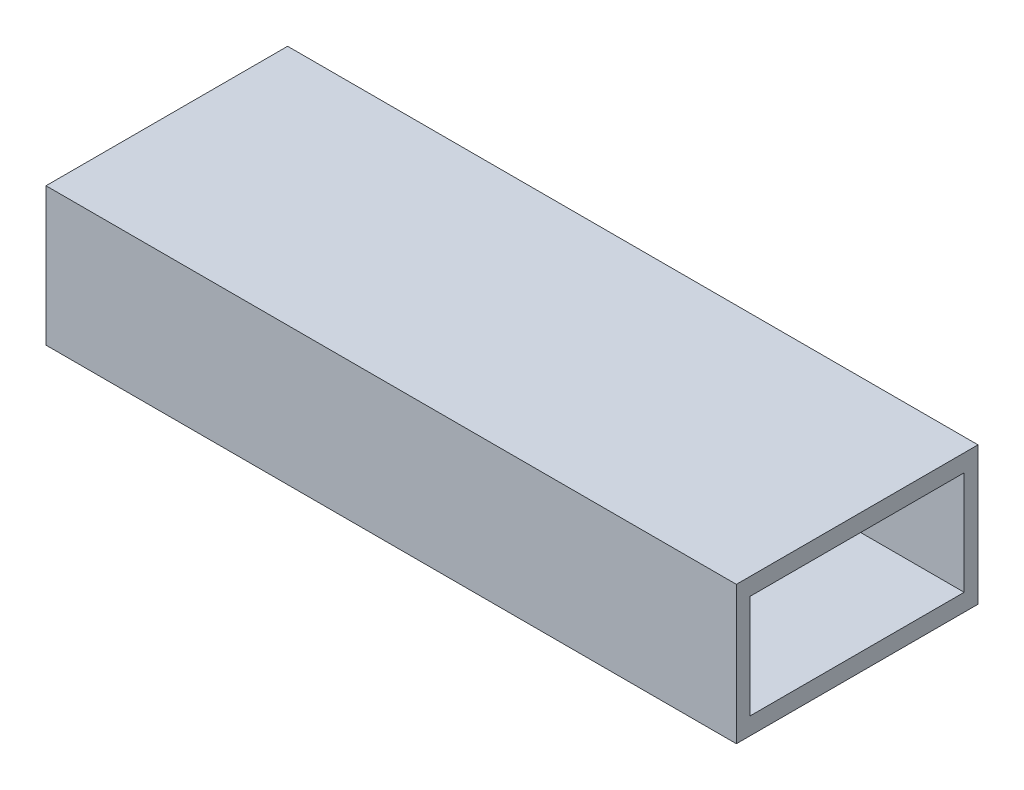
ISO-10303-21;
HEADER;
FILE_DESCRIPTION(('STEP AP214'),'2;1');
FILE_NAME('part.step','',(''),(''),'','','');
FILE_SCHEMA(('AUTOMOTIVE_DESIGN { 1 0 10303 214 1 1 1 1 }'));
ENDSEC;
DATA;
#1=APPLICATION_CONTEXT('core data for automotive mechanical design processes');
#2=APPLICATION_PROTOCOL_DEFINITION('international standard','automotive_design',2000,#1);
#3=PRODUCT_CONTEXT('',#1,'mechanical');
#4=PRODUCT('Part','Part','',(#3));
#5=PRODUCT_RELATED_PRODUCT_CATEGORY('part','',(#4));
#6=PRODUCT_DEFINITION_FORMATION('','',#4);
#7=PRODUCT_DEFINITION_CONTEXT('part definition',#1,'design');
#8=PRODUCT_DEFINITION('design','',#6,#7);
#9=PRODUCT_DEFINITION_SHAPE('','',#8);
#10=(LENGTH_UNIT() NAMED_UNIT(*) SI_UNIT(.MILLI.,.METRE.));
#11=(NAMED_UNIT(*) PLANE_ANGLE_UNIT() SI_UNIT($,.RADIAN.));
#12=(NAMED_UNIT(*) SI_UNIT($,.STERADIAN.) SOLID_ANGLE_UNIT());
#13=UNCERTAINTY_MEASURE_WITH_UNIT(LENGTH_MEASURE(1.E-05),#10,'distance_accuracy_value','');
#14=(GEOMETRIC_REPRESENTATION_CONTEXT(3) GLOBAL_UNCERTAINTY_ASSIGNED_CONTEXT((#13)) GLOBAL_UNIT_ASSIGNED_CONTEXT((#10,
#11,#12)) REPRESENTATION_CONTEXT('',''));
#15=CARTESIAN_POINT('',(0.,0.,0.));
#16=DIRECTION('',(0.,0.,1.));
#17=DIRECTION('',(1.,0.,0.));
#18=AXIS2_PLACEMENT_3D('',#15,#16,#17);
#19=CARTESIAN_POINT('',(100.,0.,0.));
#20=DIRECTION('',(1.,0.,0.));
#21=DIRECTION('',(0.,0.,-1.));
#22=AXIS2_PLACEMENT_3D('',#19,#20,#21);
#23=PLANE('',#22);
#24=DIRECTION('',(0.,1.,0.));
#25=VECTOR('',#24,1.);
#26=CARTESIAN_POINT('',(100.,10.,-17.5));
#27=LINE('',#26,#25);
#28=CARTESIAN_POINT('',(100.,-10.,-17.5));
#29=VERTEX_POINT('',#28);
#30=CARTESIAN_POINT('',(100.,10.,-17.5));
#31=VERTEX_POINT('',#30);
#32=EDGE_CURVE('E159',#29,#31,#27,.T.);
#33=ORIENTED_EDGE('',*,*,#32,.T.);
#34=DIRECTION('',(0.,0.,1.));
#35=VECTOR('',#34,1.);
#36=CARTESIAN_POINT('',(100.,10.,17.5));
#37=LINE('',#36,#35);
#38=CARTESIAN_POINT('',(100.,10.,17.5));
#39=VERTEX_POINT('',#38);
#40=EDGE_CURVE('E163',#31,#39,#37,.T.);
#41=ORIENTED_EDGE('',*,*,#40,.T.);
#42=DIRECTION('',(0.,-1.,0.));
#43=VECTOR('',#42,1.);
#44=CARTESIAN_POINT('',(100.,10.,17.5));
#45=LINE('',#44,#43);
#46=CARTESIAN_POINT('',(100.,-10.,17.5));
#47=VERTEX_POINT('',#46);
#48=EDGE_CURVE('E167',#39,#47,#45,.T.);
#49=ORIENTED_EDGE('',*,*,#48,.T.);
#50=DIRECTION('',(0.,0.,-1.));
#51=VECTOR('',#50,1.);
#52=CARTESIAN_POINT('',(100.,-10.,17.5));
#53=LINE('',#52,#51);
#54=EDGE_CURVE('E170',#47,#29,#53,.T.);
#55=ORIENTED_EDGE('',*,*,#54,.T.);
#56=EDGE_LOOP('',(#33,#41,#49,#55));
#57=FACE_BOUND('',#56,.T.);
#58=DIRECTION('',(0.,0.,1.));
#59=VECTOR('',#58,1.);
#60=CARTESIAN_POINT('',(100.,7.5,15.5));
#61=LINE('',#60,#59);
#62=CARTESIAN_POINT('',(100.,7.5,-15.5));
#63=VERTEX_POINT('',#62);
#64=CARTESIAN_POINT('',(100.,7.5,15.5));
#65=VERTEX_POINT('',#64);
#66=EDGE_CURVE('E120',#63,#65,#61,.T.);
#67=ORIENTED_EDGE('',*,*,#66,.F.);
#68=DIRECTION('',(0.,1.,0.));
#69=VECTOR('',#68,1.);
#70=CARTESIAN_POINT('',(100.,7.5,-15.5));
#71=LINE('',#70,#69);
#72=CARTESIAN_POINT('',(100.,-7.5,-15.5));
#73=VERTEX_POINT('',#72);
#74=EDGE_CURVE('E111',#73,#63,#71,.T.);
#75=ORIENTED_EDGE('',*,*,#74,.F.);
#76=DIRECTION('',(0.,0.,-1.));
#77=VECTOR('',#76,1.);
#78=CARTESIAN_POINT('',(100.,-7.5,15.5));
#79=LINE('',#78,#77);
#80=CARTESIAN_POINT('',(100.,-7.5,15.5));
#81=VERTEX_POINT('',#80);
#82=EDGE_CURVE('E137',#81,#73,#79,.T.);
#83=ORIENTED_EDGE('',*,*,#82,.F.);
#84=DIRECTION('',(0.,-1.,0.));
#85=VECTOR('',#84,1.);
#86=CARTESIAN_POINT('',(100.,7.5,15.5));
#87=LINE('',#86,#85);
#88=EDGE_CURVE('E133',#65,#81,#87,.T.);
#89=ORIENTED_EDGE('',*,*,#88,.F.);
#90=EDGE_LOOP('',(#67,#75,#83,#89));
#91=FACE_BOUND('',#90,.T.);
#92=ADVANCED_FACE('F45',(#57,#91),#23,.T.);
#93=CARTESIAN_POINT('',(0.,0.,0.));
#94=DIRECTION('',(1.,0.,0.));
#95=DIRECTION('',(0.,0.,-1.));
#96=AXIS2_PLACEMENT_3D('',#93,#94,#95);
#97=PLANE('',#96);
#98=DIRECTION('',(0.,1.,0.));
#99=VECTOR('',#98,1.);
#100=CARTESIAN_POINT('',(0.,10.,-17.5));
#101=LINE('',#100,#99);
#102=CARTESIAN_POINT('',(0.,-10.,-17.5));
#103=VERTEX_POINT('',#102);
#104=CARTESIAN_POINT('',(0.,10.,-17.5));
#105=VERTEX_POINT('',#104);
#106=EDGE_CURVE('E129',#103,#105,#101,.T.);
#107=ORIENTED_EDGE('',*,*,#106,.F.);
#108=DIRECTION('',(0.,0.,-1.));
#109=VECTOR('',#108,1.);
#110=CARTESIAN_POINT('',(0.,-10.,17.5));
#111=LINE('',#110,#109);
#112=CARTESIAN_POINT('',(0.,-10.,17.5));
#113=VERTEX_POINT('',#112);
#114=EDGE_CURVE('E164',#113,#103,#111,.T.);
#115=ORIENTED_EDGE('',*,*,#114,.F.);
#116=DIRECTION('',(0.,-1.,0.));
#117=VECTOR('',#116,1.);
#118=CARTESIAN_POINT('',(0.,10.,17.5));
#119=LINE('',#118,#117);
#120=CARTESIAN_POINT('',(0.,10.,17.5));
#121=VERTEX_POINT('',#120);
#122=EDGE_CURVE('E180',#121,#113,#119,.T.);
#123=ORIENTED_EDGE('',*,*,#122,.F.);
#124=DIRECTION('',(0.,0.,1.));
#125=VECTOR('',#124,1.);
#126=CARTESIAN_POINT('',(0.,10.,17.5));
#127=LINE('',#126,#125);
#128=EDGE_CURVE('E177',#105,#121,#127,.T.);
#129=ORIENTED_EDGE('',*,*,#128,.F.);
#130=EDGE_LOOP('',(#107,#115,#123,#129));
#131=FACE_BOUND('',#130,.T.);
#132=DIRECTION('',(0.,1.,0.));
#133=VECTOR('',#132,1.);
#134=CARTESIAN_POINT('',(0.,7.5,-15.5));
#135=LINE('',#134,#133);
#136=CARTESIAN_POINT('',(0.,-7.5,-15.5));
#137=VERTEX_POINT('',#136);
#138=CARTESIAN_POINT('',(0.,7.5,-15.5));
#139=VERTEX_POINT('',#138);
#140=EDGE_CURVE('E69',#137,#139,#135,.T.);
#141=ORIENTED_EDGE('',*,*,#140,.T.);
#142=DIRECTION('',(0.,0.,1.));
#143=VECTOR('',#142,1.);
#144=CARTESIAN_POINT('',(0.,7.5,15.5));
#145=LINE('',#144,#143);
#146=CARTESIAN_POINT('',(0.,7.5,15.5));
#147=VERTEX_POINT('',#146);
#148=EDGE_CURVE('E127',#139,#147,#145,.T.);
#149=ORIENTED_EDGE('',*,*,#148,.T.);
#150=DIRECTION('',(0.,-1.,0.));
#151=VECTOR('',#150,1.);
#152=CARTESIAN_POINT('',(0.,7.5,15.5));
#153=LINE('',#152,#151);
#154=CARTESIAN_POINT('',(0.,-7.5,15.5));
#155=VERTEX_POINT('',#154);
#156=EDGE_CURVE('E146',#147,#155,#153,.T.);
#157=ORIENTED_EDGE('',*,*,#156,.T.);
#158=DIRECTION('',(0.,0.,-1.));
#159=VECTOR('',#158,1.);
#160=CARTESIAN_POINT('',(0.,-7.5,15.5));
#161=LINE('',#160,#159);
#162=EDGE_CURVE('E121',#155,#137,#161,.T.);
#163=ORIENTED_EDGE('',*,*,#162,.T.);
#164=EDGE_LOOP('',(#141,#149,#157,#163));
#165=FACE_BOUND('',#164,.T.);
#166=ADVANCED_FACE('F203',(#131,#165),#97,.F.);
#167=CARTESIAN_POINT('',(100.,10.,-17.5));
#168=DIRECTION('',(0.,0.,1.));
#169=DIRECTION('',(0.,-1.,0.));
#170=AXIS2_PLACEMENT_3D('',#167,#168,#169);
#171=PLANE('',#170);
#172=ORIENTED_EDGE('',*,*,#106,.T.);
#173=DIRECTION('',(-1.,0.,0.));
#174=VECTOR('',#173,1.);
#175=CARTESIAN_POINT('',(100.,10.,-17.5));
#176=LINE('',#175,#174);
#177=EDGE_CURVE('E11',#31,#105,#176,.T.);
#178=ORIENTED_EDGE('',*,*,#177,.F.);
#179=ORIENTED_EDGE('',*,*,#32,.F.);
#180=DIRECTION('',(-1.,0.,0.));
#181=VECTOR('',#180,1.);
#182=CARTESIAN_POINT('',(100.,-10.,-17.5));
#183=LINE('',#182,#181);
#184=EDGE_CURVE('E173',#29,#103,#183,.T.);
#185=ORIENTED_EDGE('',*,*,#184,.T.);
#186=EDGE_LOOP('',(#172,#178,#179,#185));
#187=FACE_BOUND('',#186,.T.);
#188=ADVANCED_FACE('F47',(#187),#171,.F.);
#189=CARTESIAN_POINT('',(100.,10.,17.5));
#190=DIRECTION('',(0.,-1.,0.));
#191=DIRECTION('',(0.,0.,-1.));
#192=AXIS2_PLACEMENT_3D('',#189,#190,#191);
#193=PLANE('',#192);
#194=ORIENTED_EDGE('',*,*,#128,.T.);
#195=DIRECTION('',(-1.,0.,0.));
#196=VECTOR('',#195,1.);
#197=CARTESIAN_POINT('',(100.,10.,17.5));
#198=LINE('',#197,#196);
#199=EDGE_CURVE('E54',#39,#121,#198,.T.);
#200=ORIENTED_EDGE('',*,*,#199,.F.);
#201=ORIENTED_EDGE('',*,*,#40,.F.);
#202=ORIENTED_EDGE('',*,*,#177,.T.);
#203=EDGE_LOOP('',(#194,#200,#201,#202));
#204=FACE_BOUND('',#203,.T.);
#205=ADVANCED_FACE('F213',(#204),#193,.F.);
#206=CARTESIAN_POINT('',(100.,10.,17.5));
#207=DIRECTION('',(0.,0.,-1.));
#208=DIRECTION('',(0.,1.,0.));
#209=AXIS2_PLACEMENT_3D('',#206,#207,#208);
#210=PLANE('',#209);
#211=ORIENTED_EDGE('',*,*,#122,.T.);
#212=DIRECTION('',(-1.,0.,0.));
#213=VECTOR('',#212,1.);
#214=CARTESIAN_POINT('',(100.,-10.,17.5));
#215=LINE('',#214,#213);
#216=EDGE_CURVE('E188',#47,#113,#215,.T.);
#217=ORIENTED_EDGE('',*,*,#216,.F.);
#218=ORIENTED_EDGE('',*,*,#48,.F.);
#219=ORIENTED_EDGE('',*,*,#199,.T.);
#220=EDGE_LOOP('',(#211,#217,#218,#219));
#221=FACE_BOUND('',#220,.T.);
#222=ADVANCED_FACE('F197',(#221),#210,.F.);
#223=CARTESIAN_POINT('',(100.,-10.,17.5));
#224=DIRECTION('',(0.,1.,0.));
#225=DIRECTION('',(0.,0.,1.));
#226=AXIS2_PLACEMENT_3D('',#223,#224,#225);
#227=PLANE('',#226);
#228=ORIENTED_EDGE('',*,*,#114,.T.);
#229=ORIENTED_EDGE('',*,*,#184,.F.);
#230=ORIENTED_EDGE('',*,*,#54,.F.);
#231=ORIENTED_EDGE('',*,*,#216,.T.);
#232=EDGE_LOOP('',(#228,#229,#230,#231));
#233=FACE_BOUND('',#232,.T.);
#234=ADVANCED_FACE('F207',(#233),#227,.F.);
#235=CARTESIAN_POINT('',(100.,7.5,-15.5));
#236=DIRECTION('',(0.,0.,1.));
#237=DIRECTION('',(1.,0.,0.));
#238=AXIS2_PLACEMENT_3D('',#235,#236,#237);
#239=PLANE('',#238);
#240=ORIENTED_EDGE('',*,*,#140,.F.);
#241=DIRECTION('',(-1.,0.,0.));
#242=VECTOR('',#241,1.);
#243=CARTESIAN_POINT('',(100.,-7.5,-15.5));
#244=LINE('',#243,#242);
#245=EDGE_CURVE('E115',#73,#137,#244,.T.);
#246=ORIENTED_EDGE('',*,*,#245,.F.);
#247=ORIENTED_EDGE('',*,*,#74,.T.);
#248=DIRECTION('',(-1.,0.,0.));
#249=VECTOR('',#248,1.);
#250=CARTESIAN_POINT('',(100.,7.5,-15.5));
#251=LINE('',#250,#249);
#252=EDGE_CURVE('E114',#63,#139,#251,.T.);
#253=ORIENTED_EDGE('',*,*,#252,.T.);
#254=EDGE_LOOP('',(#240,#246,#247,#253));
#255=FACE_BOUND('',#254,.T.);
#256=ADVANCED_FACE('F113',(#255),#239,.T.);
#257=CARTESIAN_POINT('',(100.,7.5,15.5));
#258=DIRECTION('',(0.,-1.,0.));
#259=DIRECTION('',(0.,0.,-1.));
#260=AXIS2_PLACEMENT_3D('',#257,#258,#259);
#261=PLANE('',#260);
#262=ORIENTED_EDGE('',*,*,#148,.F.);
#263=ORIENTED_EDGE('',*,*,#252,.F.);
#264=ORIENTED_EDGE('',*,*,#66,.T.);
#265=DIRECTION('',(-1.,0.,0.));
#266=VECTOR('',#265,1.);
#267=CARTESIAN_POINT('',(100.,7.5,15.5));
#268=LINE('',#267,#266);
#269=EDGE_CURVE('E130',#65,#147,#268,.T.);
#270=ORIENTED_EDGE('',*,*,#269,.T.);
#271=EDGE_LOOP('',(#262,#263,#264,#270));
#272=FACE_BOUND('',#271,.T.);
#273=ADVANCED_FACE('F124',(#272),#261,.T.);
#274=CARTESIAN_POINT('',(100.,7.5,15.5));
#275=DIRECTION('',(0.,0.,-1.));
#276=DIRECTION('',(0.,1.,0.));
#277=AXIS2_PLACEMENT_3D('',#274,#275,#276);
#278=PLANE('',#277);
#279=ORIENTED_EDGE('',*,*,#156,.F.);
#280=ORIENTED_EDGE('',*,*,#269,.F.);
#281=ORIENTED_EDGE('',*,*,#88,.T.);
#282=DIRECTION('',(-1.,0.,0.));
#283=VECTOR('',#282,1.);
#284=CARTESIAN_POINT('',(100.,-7.5,15.5));
#285=LINE('',#284,#283);
#286=EDGE_CURVE('E61',#81,#155,#285,.T.);
#287=ORIENTED_EDGE('',*,*,#286,.T.);
#288=EDGE_LOOP('',(#279,#280,#281,#287));
#289=FACE_BOUND('',#288,.T.);
#290=ADVANCED_FACE('F236',(#289),#278,.T.);
#291=CARTESIAN_POINT('',(100.,-7.5,15.5));
#292=DIRECTION('',(0.,1.,0.));
#293=DIRECTION('',(0.,0.,1.));
#294=AXIS2_PLACEMENT_3D('',#291,#292,#293);
#295=PLANE('',#294);
#296=ORIENTED_EDGE('',*,*,#162,.F.);
#297=ORIENTED_EDGE('',*,*,#286,.F.);
#298=ORIENTED_EDGE('',*,*,#82,.T.);
#299=ORIENTED_EDGE('',*,*,#245,.T.);
#300=EDGE_LOOP('',(#296,#297,#298,#299));
#301=FACE_BOUND('',#300,.T.);
#302=ADVANCED_FACE('F240',(#301),#295,.T.);
#303=CLOSED_SHELL('',(#92,#166,#188,#205,#222,#234,#256,#273,#290,#302));
#304=MANIFOLD_SOLID_BREP('B2',#303);
#305=ADVANCED_BREP_SHAPE_REPRESENTATION('',(#18,#304),#14);
#306=SHAPE_DEFINITION_REPRESENTATION(#9,#305);
ENDSEC;
END-ISO-10303-21;
